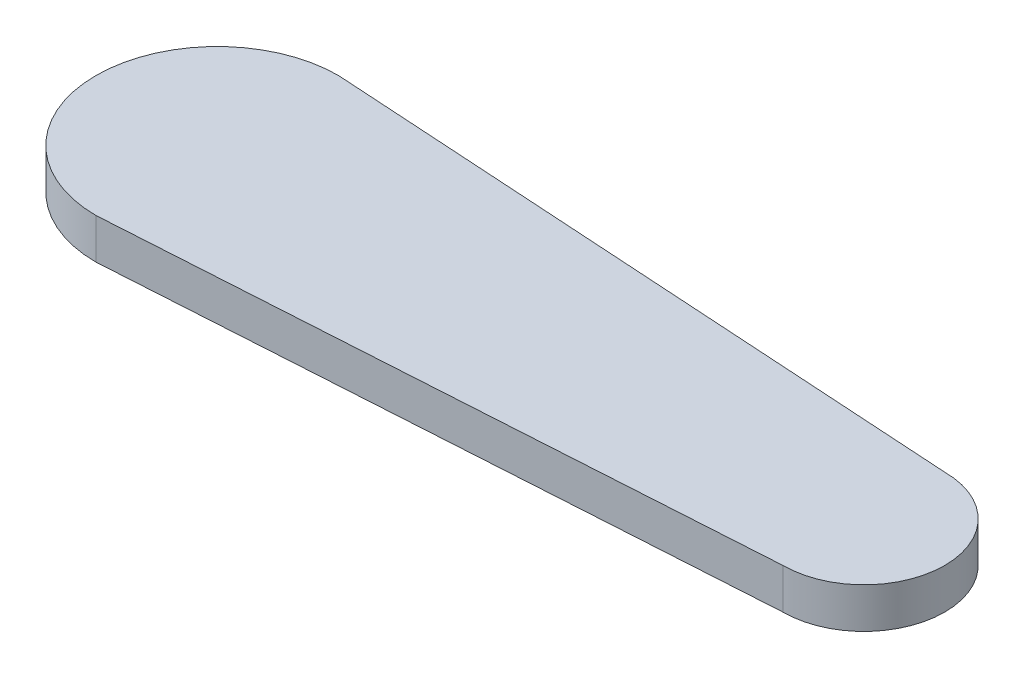
ISO-10303-21;
HEADER;
FILE_DESCRIPTION(('STEP AP214'),'2;1');
FILE_NAME('part.step','',(''),(''),'','','');
FILE_SCHEMA(('AUTOMOTIVE_DESIGN { 1 0 10303 214 1 1 1 1 }'));
ENDSEC;
DATA;
#1=APPLICATION_CONTEXT('core data for automotive mechanical design processes');
#2=APPLICATION_PROTOCOL_DEFINITION('international standard','automotive_design',2000,#1);
#3=PRODUCT_CONTEXT('',#1,'mechanical');
#4=PRODUCT('Part','Part','',(#3));
#5=PRODUCT_RELATED_PRODUCT_CATEGORY('part','',(#4));
#6=PRODUCT_DEFINITION_FORMATION('','',#4);
#7=PRODUCT_DEFINITION_CONTEXT('part definition',#1,'design');
#8=PRODUCT_DEFINITION('design','',#6,#7);
#9=PRODUCT_DEFINITION_SHAPE('','',#8);
#10=(LENGTH_UNIT() NAMED_UNIT(*) SI_UNIT(.MILLI.,.METRE.));
#11=(NAMED_UNIT(*) PLANE_ANGLE_UNIT() SI_UNIT($,.RADIAN.));
#12=(NAMED_UNIT(*) SI_UNIT($,.STERADIAN.) SOLID_ANGLE_UNIT());
#13=UNCERTAINTY_MEASURE_WITH_UNIT(LENGTH_MEASURE(1.E-05),#10,'distance_accuracy_value','');
#14=(GEOMETRIC_REPRESENTATION_CONTEXT(3) GLOBAL_UNCERTAINTY_ASSIGNED_CONTEXT((#13)) GLOBAL_UNIT_ASSIGNED_CONTEXT((#10,
#11,#12)) REPRESENTATION_CONTEXT('',''));
#15=CARTESIAN_POINT('',(0.,0.,0.));
#16=DIRECTION('',(0.,0.,1.));
#17=DIRECTION('',(1.,0.,0.));
#18=AXIS2_PLACEMENT_3D('',#15,#16,#17);
#19=CARTESIAN_POINT('',(0.,5.,0.));
#20=DIRECTION('',(0.,-1.,0.));
#21=DIRECTION('',(0.,0.,-1.));
#22=AXIS2_PLACEMENT_3D('',#19,#20,#21);
#23=CYLINDRICAL_SURFACE('',#22,15.);
#24=CARTESIAN_POINT('',(0.,0.,0.));
#25=DIRECTION('',(0.,1.,0.));
#26=DIRECTION('',(0.,0.,1.));
#27=AXIS2_PLACEMENT_3D('',#24,#25,#26);
#28=CIRCLE('',#27,15.);
#29=CARTESIAN_POINT('',(0.,0.,-15.));
#30=VERTEX_POINT('',#29);
#31=CARTESIAN_POINT('',(0.,0.,15.));
#32=VERTEX_POINT('',#31);
#33=EDGE_CURVE('E107',#30,#32,#28,.T.);
#34=ORIENTED_EDGE('',*,*,#33,.T.);
#35=DIRECTION('',(0.,-1.,0.));
#36=VECTOR('',#35,1.);
#37=CARTESIAN_POINT('',(0.,5.,15.));
#38=LINE('',#37,#36);
#39=CARTESIAN_POINT('',(0.,5.,15.));
#40=VERTEX_POINT('',#39);
#41=EDGE_CURVE('E11',#40,#32,#38,.T.);
#42=ORIENTED_EDGE('',*,*,#41,.F.);
#43=CARTESIAN_POINT('',(0.,5.,0.));
#44=DIRECTION('',(0.,1.,0.));
#45=DIRECTION('',(0.,0.,1.));
#46=AXIS2_PLACEMENT_3D('',#43,#44,#45);
#47=CIRCLE('',#46,15.);
#48=CARTESIAN_POINT('',(0.,5.,-15.));
#49=VERTEX_POINT('',#48);
#50=EDGE_CURVE('E91',#49,#40,#47,.T.);
#51=ORIENTED_EDGE('',*,*,#50,.F.);
#52=DIRECTION('',(0.,-1.,0.));
#53=VECTOR('',#52,1.);
#54=CARTESIAN_POINT('',(0.,5.,-15.));
#55=LINE('',#54,#53);
#56=EDGE_CURVE('E103',#49,#30,#55,.T.);
#57=ORIENTED_EDGE('',*,*,#56,.T.);
#58=EDGE_LOOP('',(#34,#42,#51,#57));
#59=FACE_BOUND('',#58,.T.);
#60=ADVANCED_FACE('F39',(#59),#23,.T.);
#61=CARTESIAN_POINT('',(0.,5.,15.));
#62=DIRECTION('',(-0.0623782861551806,0.,-0.998052578482889));
#63=DIRECTION('',(-0.998052578482889,0.,0.0623782861551806));
#64=AXIS2_PLACEMENT_3D('',#61,#62,#63);
#65=PLANE('',#64);
#66=DIRECTION('',(0.998052578482889,0.,-0.0623782861551806));
#67=VECTOR('',#66,1.);
#68=CARTESIAN_POINT('',(0.,0.,15.));
#69=LINE('',#68,#67);
#70=CARTESIAN_POINT('',(80.,0.,9.99999999999999));
#71=VERTEX_POINT('',#70);
#72=EDGE_CURVE('E96',#32,#71,#69,.T.);
#73=ORIENTED_EDGE('',*,*,#72,.T.);
#74=DIRECTION('',(0.,-1.,0.));
#75=VECTOR('',#74,1.);
#76=CARTESIAN_POINT('',(80.,5.,9.99999999999999));
#77=LINE('',#76,#75);
#78=CARTESIAN_POINT('',(80.,5.,9.99999999999999));
#79=VERTEX_POINT('',#78);
#80=EDGE_CURVE('E48',#79,#71,#77,.T.);
#81=ORIENTED_EDGE('',*,*,#80,.F.);
#82=DIRECTION('',(0.998052578482889,0.,-0.0623782861551806));
#83=VECTOR('',#82,1.);
#84=CARTESIAN_POINT('',(0.,5.,15.));
#85=LINE('',#84,#83);
#86=EDGE_CURVE('E86',#40,#79,#85,.T.);
#87=ORIENTED_EDGE('',*,*,#86,.F.);
#88=ORIENTED_EDGE('',*,*,#41,.T.);
#89=EDGE_LOOP('',(#73,#81,#87,#88));
#90=FACE_BOUND('',#89,.T.);
#91=ADVANCED_FACE('F95',(#90),#65,.F.);
#92=CARTESIAN_POINT('',(80.,5.,0.));
#93=DIRECTION('',(0.,-1.,0.));
#94=DIRECTION('',(0.,0.,-1.));
#95=AXIS2_PLACEMENT_3D('',#92,#93,#94);
#96=CYLINDRICAL_SURFACE('',#95,9.99999999999999);
#97=CARTESIAN_POINT('',(80.,0.,0.));
#98=DIRECTION('',(0.,1.,0.));
#99=DIRECTION('',(0.,0.,1.));
#100=AXIS2_PLACEMENT_3D('',#97,#98,#99);
#101=CIRCLE('',#100,9.99999999999999);
#102=CARTESIAN_POINT('',(80.,0.,-9.99999999999999));
#103=VERTEX_POINT('',#102);
#104=EDGE_CURVE('E73',#71,#103,#101,.T.);
#105=ORIENTED_EDGE('',*,*,#104,.T.);
#106=DIRECTION('',(0.,-1.,0.));
#107=VECTOR('',#106,1.);
#108=CARTESIAN_POINT('',(80.,5.,-9.99999999999999));
#109=LINE('',#108,#107);
#110=CARTESIAN_POINT('',(80.,5.,-9.99999999999999));
#111=VERTEX_POINT('',#110);
#112=EDGE_CURVE('E98',#111,#103,#109,.T.);
#113=ORIENTED_EDGE('',*,*,#112,.F.);
#114=CARTESIAN_POINT('',(80.,5.,0.));
#115=DIRECTION('',(0.,1.,0.));
#116=DIRECTION('',(0.,0.,1.));
#117=AXIS2_PLACEMENT_3D('',#114,#115,#116);
#118=CIRCLE('',#117,9.99999999999999);
#119=EDGE_CURVE('E89',#79,#111,#118,.T.);
#120=ORIENTED_EDGE('',*,*,#119,.F.);
#121=ORIENTED_EDGE('',*,*,#80,.T.);
#122=EDGE_LOOP('',(#105,#113,#120,#121));
#123=FACE_BOUND('',#122,.T.);
#124=ADVANCED_FACE('F99',(#123),#96,.T.);
#125=CARTESIAN_POINT('',(0.,5.,-15.));
#126=DIRECTION('',(-0.0623782861551806,0.,0.998052578482889));
#127=DIRECTION('',(0.998052578482889,0.,0.0623782861551806));
#128=AXIS2_PLACEMENT_3D('',#125,#126,#127);
#129=PLANE('',#128);
#130=DIRECTION('',(-0.998052578482889,0.,-0.0623782861551806));
#131=VECTOR('',#130,1.);
#132=CARTESIAN_POINT('',(0.,0.,-15.));
#133=LINE('',#132,#131);
#134=EDGE_CURVE('E79',#103,#30,#133,.T.);
#135=ORIENTED_EDGE('',*,*,#134,.T.);
#136=ORIENTED_EDGE('',*,*,#56,.F.);
#137=DIRECTION('',(-0.998052578482889,0.,-0.0623782861551806));
#138=VECTOR('',#137,1.);
#139=CARTESIAN_POINT('',(0.,5.,-15.));
#140=LINE('',#139,#138);
#141=EDGE_CURVE('E56',#111,#49,#140,.T.);
#142=ORIENTED_EDGE('',*,*,#141,.F.);
#143=ORIENTED_EDGE('',*,*,#112,.T.);
#144=EDGE_LOOP('',(#135,#136,#142,#143));
#145=FACE_BOUND('',#144,.T.);
#146=ADVANCED_FACE('F120',(#145),#129,.F.);
#147=CARTESIAN_POINT('',(0.,5.,0.));
#148=DIRECTION('',(0.,1.,0.));
#149=DIRECTION('',(0.,0.,1.));
#150=AXIS2_PLACEMENT_3D('',#147,#148,#149);
#151=PLANE('',#150);
#152=ORIENTED_EDGE('',*,*,#50,.T.);
#153=ORIENTED_EDGE('',*,*,#86,.T.);
#154=ORIENTED_EDGE('',*,*,#119,.T.);
#155=ORIENTED_EDGE('',*,*,#141,.T.);
#156=EDGE_LOOP('',(#152,#153,#154,#155));
#157=FACE_BOUND('',#156,.T.);
#158=ADVANCED_FACE('F87',(#157),#151,.T.);
#159=CARTESIAN_POINT('',(0.,0.,0.));
#160=DIRECTION('',(0.,1.,0.));
#161=DIRECTION('',(0.,0.,1.));
#162=AXIS2_PLACEMENT_3D('',#159,#160,#161);
#163=PLANE('',#162);
#164=ORIENTED_EDGE('',*,*,#33,.F.);
#165=ORIENTED_EDGE('',*,*,#134,.F.);
#166=ORIENTED_EDGE('',*,*,#104,.F.);
#167=ORIENTED_EDGE('',*,*,#72,.F.);
#168=EDGE_LOOP('',(#164,#165,#166,#167));
#169=FACE_BOUND('',#168,.T.);
#170=ADVANCED_FACE('F123',(#169),#163,.F.);
#171=CLOSED_SHELL('',(#60,#91,#124,#146,#158,#170));
#172=MANIFOLD_SOLID_BREP('B2',#171);
#173=ADVANCED_BREP_SHAPE_REPRESENTATION('',(#18,#172),#14);
#174=SHAPE_DEFINITION_REPRESENTATION(#9,#173);
ENDSEC;
END-ISO-10303-21;
